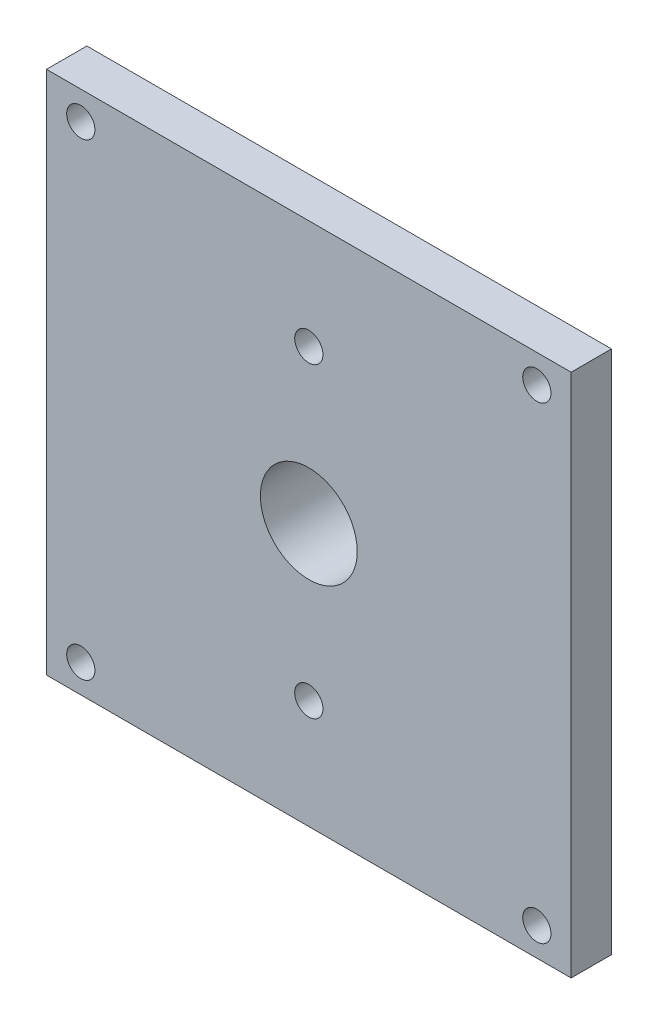
ISO-10303-21;
HEADER;
FILE_DESCRIPTION(('STEP AP214'),'2;1');
FILE_NAME('part.step','',(''),(''),'','','');
FILE_SCHEMA(('AUTOMOTIVE_DESIGN { 1 0 10303 214 1 1 1 1 }'));
ENDSEC;
DATA;
#1=APPLICATION_CONTEXT('core data for automotive mechanical design processes');
#2=APPLICATION_PROTOCOL_DEFINITION('international standard','automotive_design',2000,#1);
#3=PRODUCT_CONTEXT('',#1,'mechanical');
#4=PRODUCT('Part','Part','',(#3));
#5=PRODUCT_RELATED_PRODUCT_CATEGORY('part','',(#4));
#6=PRODUCT_DEFINITION_FORMATION('','',#4);
#7=PRODUCT_DEFINITION_CONTEXT('part definition',#1,'design');
#8=PRODUCT_DEFINITION('design','',#6,#7);
#9=PRODUCT_DEFINITION_SHAPE('','',#8);
#10=(LENGTH_UNIT() NAMED_UNIT(*) SI_UNIT(.MILLI.,.METRE.));
#11=(NAMED_UNIT(*) PLANE_ANGLE_UNIT() SI_UNIT($,.RADIAN.));
#12=(NAMED_UNIT(*) SI_UNIT($,.STERADIAN.) SOLID_ANGLE_UNIT());
#13=UNCERTAINTY_MEASURE_WITH_UNIT(LENGTH_MEASURE(1.E-05),#10,'distance_accuracy_value','');
#14=(GEOMETRIC_REPRESENTATION_CONTEXT(3) GLOBAL_UNCERTAINTY_ASSIGNED_CONTEXT((#13)) GLOBAL_UNIT_ASSIGNED_CONTEXT((#10,
#11,#12)) REPRESENTATION_CONTEXT('',''));
#15=CARTESIAN_POINT('',(0.,0.,0.));
#16=DIRECTION('',(0.,0.,1.));
#17=DIRECTION('',(1.,0.,0.));
#18=AXIS2_PLACEMENT_3D('',#15,#16,#17);
#19=CARTESIAN_POINT('',(0.,0.,-20.));
#20=DIRECTION('',(0.,0.,1.));
#21=DIRECTION('',(1.,0.,0.));
#22=AXIS2_PLACEMENT_3D('',#19,#20,#21);
#23=CYLINDRICAL_SURFACE('',#22,15.);
#24=CARTESIAN_POINT('',(0.,0.,-20.));
#25=DIRECTION('',(0.,0.,1.));
#26=DIRECTION('',(1.,0.,0.));
#27=AXIS2_PLACEMENT_3D('',#24,#25,#26);
#28=CIRCLE('',#27,15.);
#29=CARTESIAN_POINT('',(15.,0.,-20.));
#30=VERTEX_POINT('',#29);
#31=EDGE_CURVE('E11',#30,#30,#28,.T.);
#32=ORIENTED_EDGE('',*,*,#31,.T.);
#33=EDGE_LOOP('',(#32));
#34=FACE_BOUND('',#33,.T.);
#35=CARTESIAN_POINT('',(0.,0.,-5.));
#36=DIRECTION('',(0.,0.,1.));
#37=DIRECTION('',(1.,0.,0.));
#38=AXIS2_PLACEMENT_3D('',#35,#36,#37);
#39=CIRCLE('',#38,15.);
#40=CARTESIAN_POINT('',(15.,0.,-5.));
#41=VERTEX_POINT('',#40);
#42=EDGE_CURVE('E36',#41,#41,#39,.F.);
#43=ORIENTED_EDGE('',*,*,#42,.T.);
#44=EDGE_LOOP('',(#43));
#45=FACE_BOUND('',#44,.T.);
#46=ADVANCED_FACE('F33',(#34,#45),#23,.T.);
#47=CARTESIAN_POINT('',(0.,0.,-20.));
#48=DIRECTION('',(0.,0.,1.));
#49=DIRECTION('',(1.,0.,0.));
#50=AXIS2_PLACEMENT_3D('',#47,#48,#49);
#51=PLANE('',#50);
#52=CARTESIAN_POINT('',(0.,0.,-20.));
#53=DIRECTION('',(0.,0.,-1.));
#54=DIRECTION('',(-1.,0.,0.));
#55=AXIS2_PLACEMENT_3D('',#52,#53,#54);
#56=CIRCLE('',#55,8.);
#57=CARTESIAN_POINT('',(-8.,0.,-20.));
#58=VERTEX_POINT('',#57);
#59=EDGE_CURVE('E116',#58,#58,#56,.T.);
#60=ORIENTED_EDGE('',*,*,#59,.F.);
#61=EDGE_LOOP('',(#60));
#62=FACE_BOUND('',#61,.T.);
#63=ORIENTED_EDGE('',*,*,#31,.F.);
#64=EDGE_LOOP('',(#63));
#65=FACE_BOUND('',#64,.T.);
#66=ADVANCED_FACE('F141',(#62,#65),#51,.F.);
#67=CARTESIAN_POINT('',(0.,0.,-15.));
#68=DIRECTION('',(0.,0.,-1.));
#69=DIRECTION('',(-1.,0.,0.));
#70=AXIS2_PLACEMENT_3D('',#67,#68,#69);
#71=CYLINDRICAL_SURFACE('',#70,8.);
#72=CARTESIAN_POINT('',(0.,0.,-15.));
#73=DIRECTION('',(0.,0.,-1.));
#74=DIRECTION('',(-1.,0.,0.));
#75=AXIS2_PLACEMENT_3D('',#72,#73,#74);
#76=CIRCLE('',#75,8.);
#77=CARTESIAN_POINT('',(-8.,0.,-15.));
#78=VERTEX_POINT('',#77);
#79=EDGE_CURVE('E42',#78,#78,#76,.T.);
#80=ORIENTED_EDGE('',*,*,#79,.F.);
#81=EDGE_LOOP('',(#80));
#82=FACE_BOUND('',#81,.T.);
#83=ORIENTED_EDGE('',*,*,#59,.T.);
#84=EDGE_LOOP('',(#83));
#85=FACE_BOUND('',#84,.T.);
#86=ADVANCED_FACE('F146',(#82,#85),#71,.F.);
#87=CARTESIAN_POINT('',(0.,0.,-15.));
#88=DIRECTION('',(0.,0.,-1.));
#89=DIRECTION('',(-1.,0.,0.));
#90=AXIS2_PLACEMENT_3D('',#87,#88,#89);
#91=PLANE('',#90);
#92=CARTESIAN_POINT('',(0.,0.,-15.));
#93=DIRECTION('',(0.,0.,-1.));
#94=DIRECTION('',(-1.,0.,0.));
#95=AXIS2_PLACEMENT_3D('',#92,#93,#94);
#96=CIRCLE('',#95,6.);
#97=CARTESIAN_POINT('',(-6.,0.,-15.));
#98=VERTEX_POINT('',#97);
#99=EDGE_CURVE('E106',#98,#98,#96,.T.);
#100=ORIENTED_EDGE('',*,*,#99,.F.);
#101=EDGE_LOOP('',(#100));
#102=FACE_BOUND('',#101,.T.);
#103=ORIENTED_EDGE('',*,*,#79,.T.);
#104=EDGE_LOOP('',(#103));
#105=FACE_BOUND('',#104,.T.);
#106=ADVANCED_FACE('F154',(#102,#105),#91,.T.);
#107=CARTESIAN_POINT('',(32.5,32.5,-5.));
#108=DIRECTION('',(1.,0.,0.));
#109=DIRECTION('',(0.,1.,0.));
#110=AXIS2_PLACEMENT_3D('',#107,#108,#109);
#111=PLANE('',#110);
#112=DIRECTION('',(0.,1.,0.));
#113=VECTOR('',#112,1.);
#114=CARTESIAN_POINT('',(32.5,32.5,0.));
#115=LINE('',#114,#113);
#116=CARTESIAN_POINT('',(32.5,-32.5,0.));
#117=VERTEX_POINT('',#116);
#118=CARTESIAN_POINT('',(32.5,32.5,0.));
#119=VERTEX_POINT('',#118);
#120=EDGE_CURVE('E102',#117,#119,#115,.T.);
#121=ORIENTED_EDGE('',*,*,#120,.F.);
#122=DIRECTION('',(0.,0.,1.));
#123=VECTOR('',#122,1.);
#124=CARTESIAN_POINT('',(32.5,-32.5,-5.));
#125=LINE('',#124,#123);
#126=CARTESIAN_POINT('',(32.5,-32.5,-5.));
#127=VERTEX_POINT('',#126);
#128=EDGE_CURVE('E50',#127,#117,#125,.T.);
#129=ORIENTED_EDGE('',*,*,#128,.F.);
#130=DIRECTION('',(0.,1.,0.));
#131=VECTOR('',#130,1.);
#132=CARTESIAN_POINT('',(32.5,32.5,-5.));
#133=LINE('',#132,#131);
#134=CARTESIAN_POINT('',(32.5,32.5,-5.));
#135=VERTEX_POINT('',#134);
#136=EDGE_CURVE('E95',#127,#135,#133,.T.);
#137=ORIENTED_EDGE('',*,*,#136,.T.);
#138=DIRECTION('',(0.,0.,1.));
#139=VECTOR('',#138,1.);
#140=CARTESIAN_POINT('',(32.5,32.5,-5.));
#141=LINE('',#140,#139);
#142=EDGE_CURVE('E78',#135,#119,#141,.T.);
#143=ORIENTED_EDGE('',*,*,#142,.T.);
#144=EDGE_LOOP('',(#121,#129,#137,#143));
#145=FACE_BOUND('',#144,.T.);
#146=ADVANCED_FACE('F160',(#145),#111,.T.);
#147=CARTESIAN_POINT('',(-32.5,-32.5,-5.));
#148=DIRECTION('',(0.,-1.,0.));
#149=DIRECTION('',(0.,0.,-1.));
#150=AXIS2_PLACEMENT_3D('',#147,#148,#149);
#151=PLANE('',#150);
#152=DIRECTION('',(1.,0.,0.));
#153=VECTOR('',#152,1.);
#154=CARTESIAN_POINT('',(-32.5,-32.5,0.));
#155=LINE('',#154,#153);
#156=CARTESIAN_POINT('',(-32.5,-32.5,0.));
#157=VERTEX_POINT('',#156);
#158=EDGE_CURVE('E97',#157,#117,#155,.T.);
#159=ORIENTED_EDGE('',*,*,#158,.F.);
#160=DIRECTION('',(0.,0.,1.));
#161=VECTOR('',#160,1.);
#162=CARTESIAN_POINT('',(-32.5,-32.5,-5.));
#163=LINE('',#162,#161);
#164=CARTESIAN_POINT('',(-32.5,-32.5,-5.));
#165=VERTEX_POINT('',#164);
#166=EDGE_CURVE('E67',#165,#157,#163,.T.);
#167=ORIENTED_EDGE('',*,*,#166,.F.);
#168=DIRECTION('',(1.,0.,0.));
#169=VECTOR('',#168,1.);
#170=CARTESIAN_POINT('',(-32.5,-32.5,-5.));
#171=LINE('',#170,#169);
#172=EDGE_CURVE('E92',#165,#127,#171,.T.);
#173=ORIENTED_EDGE('',*,*,#172,.T.);
#174=ORIENTED_EDGE('',*,*,#128,.T.);
#175=EDGE_LOOP('',(#159,#167,#173,#174));
#176=FACE_BOUND('',#175,.T.);
#177=ADVANCED_FACE('F163',(#176),#151,.T.);
#178=CARTESIAN_POINT('',(-32.5,32.5,-5.));
#179=DIRECTION('',(-1.,0.,0.));
#180=DIRECTION('',(0.,-1.,0.));
#181=AXIS2_PLACEMENT_3D('',#178,#179,#180);
#182=PLANE('',#181);
#183=DIRECTION('',(0.,-1.,0.));
#184=VECTOR('',#183,1.);
#185=CARTESIAN_POINT('',(-32.5,32.5,0.));
#186=LINE('',#185,#184);
#187=CARTESIAN_POINT('',(-32.5,32.5,0.));
#188=VERTEX_POINT('',#187);
#189=EDGE_CURVE('E86',#188,#157,#186,.T.);
#190=ORIENTED_EDGE('',*,*,#189,.F.);
#191=DIRECTION('',(0.,0.,1.));
#192=VECTOR('',#191,1.);
#193=CARTESIAN_POINT('',(-32.5,32.5,-5.));
#194=LINE('',#193,#192);
#195=CARTESIAN_POINT('',(-32.5,32.5,-5.));
#196=VERTEX_POINT('',#195);
#197=EDGE_CURVE('E81',#196,#188,#194,.T.);
#198=ORIENTED_EDGE('',*,*,#197,.F.);
#199=DIRECTION('',(0.,-1.,0.));
#200=VECTOR('',#199,1.);
#201=CARTESIAN_POINT('',(-32.5,32.5,-5.));
#202=LINE('',#201,#200);
#203=EDGE_CURVE('E84',#196,#165,#202,.T.);
#204=ORIENTED_EDGE('',*,*,#203,.T.);
#205=ORIENTED_EDGE('',*,*,#166,.T.);
#206=EDGE_LOOP('',(#190,#198,#204,#205));
#207=FACE_BOUND('',#206,.T.);
#208=ADVANCED_FACE('F83',(#207),#182,.T.);
#209=CARTESIAN_POINT('',(-32.5,32.5,-5.));
#210=DIRECTION('',(0.,1.,0.));
#211=DIRECTION('',(0.,0.,1.));
#212=AXIS2_PLACEMENT_3D('',#209,#210,#211);
#213=PLANE('',#212);
#214=DIRECTION('',(-1.,0.,0.));
#215=VECTOR('',#214,1.);
#216=CARTESIAN_POINT('',(-32.5,32.5,0.));
#217=LINE('',#216,#215);
#218=EDGE_CURVE('E105',#119,#188,#217,.T.);
#219=ORIENTED_EDGE('',*,*,#218,.F.);
#220=ORIENTED_EDGE('',*,*,#142,.F.);
#221=DIRECTION('',(-1.,0.,0.));
#222=VECTOR('',#221,1.);
#223=CARTESIAN_POINT('',(-32.5,32.5,-5.));
#224=LINE('',#223,#222);
#225=EDGE_CURVE('E91',#135,#196,#224,.T.);
#226=ORIENTED_EDGE('',*,*,#225,.T.);
#227=ORIENTED_EDGE('',*,*,#197,.T.);
#228=EDGE_LOOP('',(#219,#220,#226,#227));
#229=FACE_BOUND('',#228,.T.);
#230=ADVANCED_FACE('F94',(#229),#213,.T.);
#231=CARTESIAN_POINT('',(0.,0.,-5.));
#232=DIRECTION('',(0.,0.,1.));
#233=DIRECTION('',(1.,0.,0.));
#234=AXIS2_PLACEMENT_3D('',#231,#232,#233);
#235=PLANE('',#234);
#236=CARTESIAN_POINT('',(0.,-19.,-5.));
#237=DIRECTION('',(0.,0.,1.));
#238=DIRECTION('',(1.,0.,0.));
#239=AXIS2_PLACEMENT_3D('',#236,#237,#238);
#240=CIRCLE('',#239,1.75);
#241=CARTESIAN_POINT('',(1.75,-19.,-5.));
#242=VERTEX_POINT('',#241);
#243=EDGE_CURVE('E266',#242,#242,#240,.T.);
#244=ORIENTED_EDGE('',*,*,#243,.T.);
#245=EDGE_LOOP('',(#244));
#246=FACE_BOUND('',#245,.T.);
#247=CARTESIAN_POINT('',(0.,19.,-5.));
#248=DIRECTION('',(0.,0.,1.));
#249=DIRECTION('',(1.,0.,0.));
#250=AXIS2_PLACEMENT_3D('',#247,#248,#249);
#251=CIRCLE('',#250,1.75);
#252=CARTESIAN_POINT('',(1.75,19.,-5.));
#253=VERTEX_POINT('',#252);
#254=EDGE_CURVE('E270',#253,#253,#251,.T.);
#255=ORIENTED_EDGE('',*,*,#254,.T.);
#256=EDGE_LOOP('',(#255));
#257=FACE_BOUND('',#256,.T.);
#258=CARTESIAN_POINT('',(28.25,-29.,-5.));
#259=DIRECTION('',(0.,0.,-1.));
#260=DIRECTION('',(1.,0.,0.));
#261=AXIS2_PLACEMENT_3D('',#258,#259,#260);
#262=CIRCLE('',#261,1.75);
#263=CARTESIAN_POINT('',(30.,-29.,-5.));
#264=VERTEX_POINT('',#263);
#265=EDGE_CURVE('E276',#264,#264,#262,.T.);
#266=ORIENTED_EDGE('',*,*,#265,.F.);
#267=EDGE_LOOP('',(#266));
#268=FACE_BOUND('',#267,.T.);
#269=CARTESIAN_POINT('',(-28.25,-29.,-5.));
#270=DIRECTION('',(0.,0.,-1.));
#271=DIRECTION('',(-1.,0.,0.));
#272=AXIS2_PLACEMENT_3D('',#269,#270,#271);
#273=CIRCLE('',#272,1.75);
#274=CARTESIAN_POINT('',(-30.,-29.,-5.));
#275=VERTEX_POINT('',#274);
#276=EDGE_CURVE('E280',#275,#275,#273,.T.);
#277=ORIENTED_EDGE('',*,*,#276,.F.);
#278=EDGE_LOOP('',(#277));
#279=FACE_BOUND('',#278,.T.);
#280=CARTESIAN_POINT('',(-28.25,29.,-5.));
#281=DIRECTION('',(0.,0.,-1.));
#282=DIRECTION('',(1.,0.,0.));
#283=AXIS2_PLACEMENT_3D('',#280,#281,#282);
#284=CIRCLE('',#283,1.75);
#285=CARTESIAN_POINT('',(-26.5,29.,-5.));
#286=VERTEX_POINT('',#285);
#287=EDGE_CURVE('E286',#286,#286,#284,.T.);
#288=ORIENTED_EDGE('',*,*,#287,.F.);
#289=EDGE_LOOP('',(#288));
#290=FACE_BOUND('',#289,.T.);
#291=CARTESIAN_POINT('',(28.25,29.,-5.));
#292=DIRECTION('',(0.,0.,-1.));
#293=DIRECTION('',(-1.,0.,0.));
#294=AXIS2_PLACEMENT_3D('',#291,#292,#293);
#295=CIRCLE('',#294,1.75);
#296=CARTESIAN_POINT('',(26.5,29.,-5.));
#297=VERTEX_POINT('',#296);
#298=EDGE_CURVE('E292',#297,#297,#295,.T.);
#299=ORIENTED_EDGE('',*,*,#298,.F.);
#300=EDGE_LOOP('',(#299));
#301=FACE_BOUND('',#300,.T.);
#302=ORIENTED_EDGE('',*,*,#42,.F.);
#303=EDGE_LOOP('',(#302));
#304=FACE_BOUND('',#303,.T.);
#305=ORIENTED_EDGE('',*,*,#136,.F.);
#306=ORIENTED_EDGE('',*,*,#172,.F.);
#307=ORIENTED_EDGE('',*,*,#203,.F.);
#308=ORIENTED_EDGE('',*,*,#225,.F.);
#309=EDGE_LOOP('',(#305,#306,#307,#308));
#310=FACE_BOUND('',#309,.T.);
#311=ADVANCED_FACE('F90',(#246,#257,#268,#279,#290,#301,#304,#310),#235,.F.);
#312=CARTESIAN_POINT('',(0.,0.,0.));
#313=DIRECTION('',(0.,0.,1.));
#314=DIRECTION('',(1.,0.,0.));
#315=AXIS2_PLACEMENT_3D('',#312,#313,#314);
#316=PLANE('',#315);
#317=CARTESIAN_POINT('',(0.,-19.,0.));
#318=DIRECTION('',(0.,0.,1.));
#319=DIRECTION('',(-1.,0.,0.));
#320=AXIS2_PLACEMENT_3D('',#317,#318,#319);
#321=CIRCLE('',#320,1.75);
#322=CARTESIAN_POINT('',(-1.75,-19.,0.));
#323=VERTEX_POINT('',#322);
#324=EDGE_CURVE('E264',#323,#323,#321,.T.);
#325=ORIENTED_EDGE('',*,*,#324,.F.);
#326=EDGE_LOOP('',(#325));
#327=FACE_BOUND('',#326,.T.);
#328=CARTESIAN_POINT('',(0.,19.,0.));
#329=DIRECTION('',(0.,0.,1.));
#330=DIRECTION('',(1.,0.,0.));
#331=AXIS2_PLACEMENT_3D('',#328,#329,#330);
#332=CIRCLE('',#331,1.75);
#333=CARTESIAN_POINT('',(1.75,19.,0.));
#334=VERTEX_POINT('',#333);
#335=EDGE_CURVE('E267',#334,#334,#332,.T.);
#336=ORIENTED_EDGE('',*,*,#335,.F.);
#337=EDGE_LOOP('',(#336));
#338=FACE_BOUND('',#337,.T.);
#339=CARTESIAN_POINT('',(28.25,-29.,0.));
#340=DIRECTION('',(0.,0.,-1.));
#341=DIRECTION('',(1.,0.,0.));
#342=AXIS2_PLACEMENT_3D('',#339,#340,#341);
#343=CIRCLE('',#342,1.75);
#344=CARTESIAN_POINT('',(30.,-29.,0.));
#345=VERTEX_POINT('',#344);
#346=EDGE_CURVE('E277',#345,#345,#343,.T.);
#347=ORIENTED_EDGE('',*,*,#346,.T.);
#348=EDGE_LOOP('',(#347));
#349=FACE_BOUND('',#348,.T.);
#350=CARTESIAN_POINT('',(-28.25,-29.,0.));
#351=DIRECTION('',(0.,0.,-1.));
#352=DIRECTION('',(-1.,0.,0.));
#353=AXIS2_PLACEMENT_3D('',#350,#351,#352);
#354=CIRCLE('',#353,1.75);
#355=CARTESIAN_POINT('',(-30.,-29.,0.));
#356=VERTEX_POINT('',#355);
#357=EDGE_CURVE('E283',#356,#356,#354,.T.);
#358=ORIENTED_EDGE('',*,*,#357,.T.);
#359=EDGE_LOOP('',(#358));
#360=FACE_BOUND('',#359,.T.);
#361=CARTESIAN_POINT('',(-28.25,29.,0.));
#362=DIRECTION('',(0.,0.,-1.));
#363=DIRECTION('',(1.,0.,0.));
#364=AXIS2_PLACEMENT_3D('',#361,#362,#363);
#365=CIRCLE('',#364,1.75);
#366=CARTESIAN_POINT('',(-26.5,29.,0.));
#367=VERTEX_POINT('',#366);
#368=EDGE_CURVE('E289',#367,#367,#365,.T.);
#369=ORIENTED_EDGE('',*,*,#368,.T.);
#370=EDGE_LOOP('',(#369));
#371=FACE_BOUND('',#370,.T.);
#372=CARTESIAN_POINT('',(28.25,29.,0.));
#373=DIRECTION('',(0.,0.,-1.));
#374=DIRECTION('',(-1.,0.,0.));
#375=AXIS2_PLACEMENT_3D('',#372,#373,#374);
#376=CIRCLE('',#375,1.75);
#377=CARTESIAN_POINT('',(26.5,29.,0.));
#378=VERTEX_POINT('',#377);
#379=EDGE_CURVE('E295',#378,#378,#376,.T.);
#380=ORIENTED_EDGE('',*,*,#379,.T.);
#381=EDGE_LOOP('',(#380));
#382=FACE_BOUND('',#381,.T.);
#383=CARTESIAN_POINT('',(0.,0.,0.));
#384=DIRECTION('',(0.,0.,1.));
#385=DIRECTION('',(1.,0.,0.));
#386=AXIS2_PLACEMENT_3D('',#383,#384,#385);
#387=CIRCLE('',#386,6.);
#388=CARTESIAN_POINT('',(6.,0.,0.));
#389=VERTEX_POINT('',#388);
#390=EDGE_CURVE('E298',#389,#389,#387,.T.);
#391=ORIENTED_EDGE('',*,*,#390,.F.);
#392=EDGE_LOOP('',(#391));
#393=FACE_BOUND('',#392,.T.);
#394=ORIENTED_EDGE('',*,*,#120,.T.);
#395=ORIENTED_EDGE('',*,*,#218,.T.);
#396=ORIENTED_EDGE('',*,*,#189,.T.);
#397=ORIENTED_EDGE('',*,*,#158,.T.);
#398=EDGE_LOOP('',(#394,#395,#396,#397));
#399=FACE_BOUND('',#398,.T.);
#400=ADVANCED_FACE('F125',(#327,#338,#349,#360,#371,#382,#393,#399),#316,.T.);
#401=CARTESIAN_POINT('',(0.,0.,-20.));
#402=DIRECTION('',(0.,0.,1.));
#403=DIRECTION('',(1.,0.,0.));
#404=AXIS2_PLACEMENT_3D('',#401,#402,#403);
#405=CYLINDRICAL_SURFACE('',#404,6.);
#406=ORIENTED_EDGE('',*,*,#99,.T.);
#407=EDGE_LOOP('',(#406));
#408=FACE_BOUND('',#407,.T.);
#409=ORIENTED_EDGE('',*,*,#390,.T.);
#410=EDGE_LOOP('',(#409));
#411=FACE_BOUND('',#410,.T.);
#412=ADVANCED_FACE('F132',(#408,#411),#405,.F.);
#413=CARTESIAN_POINT('',(28.25,29.,0.));
#414=DIRECTION('',(0.,0.,-1.));
#415=DIRECTION('',(-1.,0.,0.));
#416=AXIS2_PLACEMENT_3D('',#413,#414,#415);
#417=CYLINDRICAL_SURFACE('',#416,1.75);
#418=ORIENTED_EDGE('',*,*,#379,.F.);
#419=EDGE_LOOP('',(#418));
#420=FACE_BOUND('',#419,.T.);
#421=ORIENTED_EDGE('',*,*,#298,.T.);
#422=EDGE_LOOP('',(#421));
#423=FACE_BOUND('',#422,.T.);
#424=ADVANCED_FACE('F200',(#420,#423),#417,.F.);
#425=CARTESIAN_POINT('',(-28.25,29.,0.));
#426=DIRECTION('',(0.,0.,-1.));
#427=DIRECTION('',(-1.,0.,0.));
#428=AXIS2_PLACEMENT_3D('',#425,#426,#427);
#429=CYLINDRICAL_SURFACE('',#428,1.75);
#430=ORIENTED_EDGE('',*,*,#368,.F.);
#431=EDGE_LOOP('',(#430));
#432=FACE_BOUND('',#431,.T.);
#433=ORIENTED_EDGE('',*,*,#287,.T.);
#434=EDGE_LOOP('',(#433));
#435=FACE_BOUND('',#434,.T.);
#436=ADVANCED_FACE('F206',(#432,#435),#429,.F.);
#437=CARTESIAN_POINT('',(-28.25,-29.,0.));
#438=DIRECTION('',(0.,0.,-1.));
#439=DIRECTION('',(-1.,0.,0.));
#440=AXIS2_PLACEMENT_3D('',#437,#438,#439);
#441=CYLINDRICAL_SURFACE('',#440,1.75);
#442=ORIENTED_EDGE('',*,*,#357,.F.);
#443=EDGE_LOOP('',(#442));
#444=FACE_BOUND('',#443,.T.);
#445=ORIENTED_EDGE('',*,*,#276,.T.);
#446=EDGE_LOOP('',(#445));
#447=FACE_BOUND('',#446,.T.);
#448=ADVANCED_FACE('F214',(#444,#447),#441,.F.);
#449=CARTESIAN_POINT('',(28.25,-29.,0.));
#450=DIRECTION('',(0.,0.,-1.));
#451=DIRECTION('',(-1.,0.,0.));
#452=AXIS2_PLACEMENT_3D('',#449,#450,#451);
#453=CYLINDRICAL_SURFACE('',#452,1.75);
#454=ORIENTED_EDGE('',*,*,#346,.F.);
#455=EDGE_LOOP('',(#454));
#456=FACE_BOUND('',#455,.T.);
#457=ORIENTED_EDGE('',*,*,#265,.T.);
#458=EDGE_LOOP('',(#457));
#459=FACE_BOUND('',#458,.T.);
#460=ADVANCED_FACE('F222',(#456,#459),#453,.F.);
#461=CARTESIAN_POINT('',(0.,19.,-20.));
#462=DIRECTION('',(0.,0.,1.));
#463=DIRECTION('',(1.,0.,0.));
#464=AXIS2_PLACEMENT_3D('',#461,#462,#463);
#465=CYLINDRICAL_SURFACE('',#464,1.75);
#466=ORIENTED_EDGE('',*,*,#335,.T.);
#467=EDGE_LOOP('',(#466));
#468=FACE_BOUND('',#467,.T.);
#469=ORIENTED_EDGE('',*,*,#254,.F.);
#470=EDGE_LOOP('',(#469));
#471=FACE_BOUND('',#470,.T.);
#472=ADVANCED_FACE('F229',(#468,#471),#465,.F.);
#473=CARTESIAN_POINT('',(0.,-19.,-20.));
#474=DIRECTION('',(0.,0.,1.));
#475=DIRECTION('',(1.,0.,0.));
#476=AXIS2_PLACEMENT_3D('',#473,#474,#475);
#477=CYLINDRICAL_SURFACE('',#476,1.75);
#478=ORIENTED_EDGE('',*,*,#324,.T.);
#479=EDGE_LOOP('',(#478));
#480=FACE_BOUND('',#479,.T.);
#481=ORIENTED_EDGE('',*,*,#243,.F.);
#482=EDGE_LOOP('',(#481));
#483=FACE_BOUND('',#482,.T.);
#484=ADVANCED_FACE('F236',(#480,#483),#477,.F.);
#485=CLOSED_SHELL('',(#46,#66,#86,#106,#146,#177,#208,#230,#311,#400,#412,#424,#436,#448,#460,
#472,#484));
#486=MANIFOLD_SOLID_BREP('B2',#485);
#487=ADVANCED_BREP_SHAPE_REPRESENTATION('',(#18,#486),#14);
#488=SHAPE_DEFINITION_REPRESENTATION(#9,#487);
ENDSEC;
END-ISO-10303-21;
